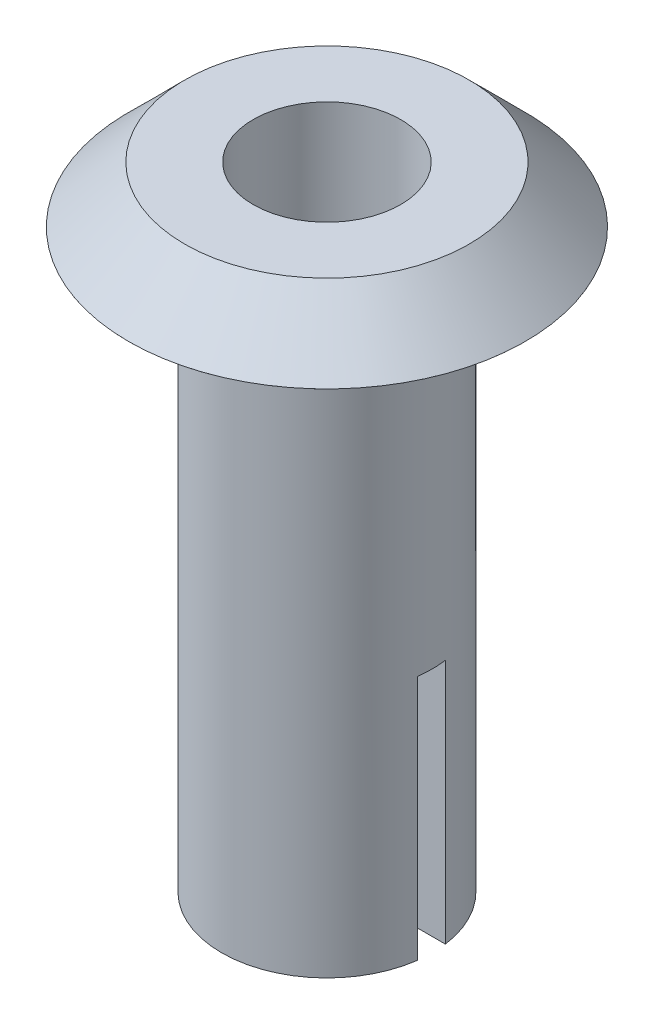
ISO-10303-21;
HEADER;
FILE_DESCRIPTION(('STEP AP214'),'2;1');
FILE_NAME('part.step','',(''),(''),'','','');
FILE_SCHEMA(('AUTOMOTIVE_DESIGN { 1 0 10303 214 1 1 1 1 }'));
ENDSEC;
DATA;
#1=APPLICATION_CONTEXT('core data for automotive mechanical design processes');
#2=APPLICATION_PROTOCOL_DEFINITION('international standard','automotive_design',2000,#1);
#3=PRODUCT_CONTEXT('',#1,'mechanical');
#4=PRODUCT('Part','Part','',(#3));
#5=PRODUCT_RELATED_PRODUCT_CATEGORY('part','',(#4));
#6=PRODUCT_DEFINITION_FORMATION('','',#4);
#7=PRODUCT_DEFINITION_CONTEXT('part definition',#1,'design');
#8=PRODUCT_DEFINITION('design','',#6,#7);
#9=PRODUCT_DEFINITION_SHAPE('','',#8);
#10=(LENGTH_UNIT() NAMED_UNIT(*) SI_UNIT(.MILLI.,.METRE.));
#11=(NAMED_UNIT(*) PLANE_ANGLE_UNIT() SI_UNIT($,.RADIAN.));
#12=(NAMED_UNIT(*) SI_UNIT($,.STERADIAN.) SOLID_ANGLE_UNIT());
#13=UNCERTAINTY_MEASURE_WITH_UNIT(LENGTH_MEASURE(1.E-05),#10,'distance_accuracy_value','');
#14=(GEOMETRIC_REPRESENTATION_CONTEXT(3) GLOBAL_UNCERTAINTY_ASSIGNED_CONTEXT((#13)) GLOBAL_UNIT_ASSIGNED_CONTEXT((#10,
#11,#12)) REPRESENTATION_CONTEXT('',''));
#15=CARTESIAN_POINT('',(0.,0.,0.));
#16=DIRECTION('',(0.,0.,1.));
#17=DIRECTION('',(1.,0.,0.));
#18=AXIS2_PLACEMENT_3D('',#15,#16,#17);
#19=CARTESIAN_POINT('',(0.,0.,0.));
#20=DIRECTION('',(0.,1.,0.));
#21=DIRECTION('',(0.,0.,1.));
#22=AXIS2_PLACEMENT_3D('',#19,#20,#21);
#23=PLANE('',#22);
#24=CARTESIAN_POINT('',(0.,0.,0.));
#25=DIRECTION('',(0.,1.,0.));
#26=DIRECTION('',(0.,0.,1.));
#27=AXIS2_PLACEMENT_3D('',#24,#25,#26);
#28=CIRCLE('',#27,1.5);
#29=CARTESIAN_POINT('',(1.48660687473185,0.,-0.2));
#30=VERTEX_POINT('',#29);
#31=CARTESIAN_POINT('',(-1.48660687473185,0.,-0.2));
#32=VERTEX_POINT('',#31);
#33=EDGE_CURVE('E131',#30,#32,#28,.T.);
#34=ORIENTED_EDGE('',*,*,#33,.F.);
#35=DIRECTION('',(1.,0.,0.));
#36=VECTOR('',#35,1.);
#37=CARTESIAN_POINT('',(-1.5,0.,-0.2));
#38=LINE('',#37,#36);
#39=EDGE_CURVE('E118',#32,#30,#38,.T.);
#40=ORIENTED_EDGE('',*,*,#39,.F.);
#41=EDGE_LOOP('',(#34,#40));
#42=FACE_BOUND('',#41,.T.);
#43=ADVANCED_FACE('F35',(#42),#23,.F.);
#44=CARTESIAN_POINT('',(0.,1.5001,0.));
#45=DIRECTION('',(0.,1.,0.));
#46=DIRECTION('',(0.,0.,1.));
#47=AXIS2_PLACEMENT_3D('',#44,#45,#46);
#48=PLANE('',#47);
#49=DIRECTION('',(-1.,0.,0.));
#50=VECTOR('',#49,1.);
#51=CARTESIAN_POINT('',(0.,1.5001,-0.2));
#52=LINE('',#51,#50);
#53=CARTESIAN_POINT('',(0.15,1.5001,-0.2));
#54=VERTEX_POINT('',#53);
#55=CARTESIAN_POINT('',(-0.150000000000001,1.50009999999999,-0.2));
#56=VERTEX_POINT('',#55);
#57=EDGE_CURVE('E128',#54,#56,#52,.T.);
#58=ORIENTED_EDGE('',*,*,#57,.F.);
#59=CARTESIAN_POINT('',(0.,1.5001,0.));
#60=DIRECTION('',(0.,1.,0.));
#61=DIRECTION('',(0.,0.,1.));
#62=AXIS2_PLACEMENT_3D('',#59,#60,#61);
#63=CIRCLE('',#62,0.25);
#64=EDGE_CURVE('E152',#54,#56,#63,.T.);
#65=ORIENTED_EDGE('',*,*,#64,.T.);
#66=EDGE_LOOP('',(#58,#65));
#67=FACE_BOUND('',#66,.T.);
#68=ADVANCED_FACE('F177',(#67),#48,.T.);
#69=CARTESIAN_POINT('',(0.,2.3001,0.));
#70=DIRECTION('',(0.,1.,0.));
#71=DIRECTION('',(0.,0.,1.));
#72=AXIS2_PLACEMENT_3D('',#69,#70,#71);
#73=DEGENERATE_TOROIDAL_SURFACE('',#72,0.25,0.8,.T.);
#74=ORIENTED_EDGE('',*,*,#64,.F.);
#75=CARTESIAN_POINT('',(0.,1.50166402886642,-0.2));
#76=CARTESIAN_POINT('',(0.0166698415826688,1.50166571667046,-0.2));
#77=CARTESIAN_POINT('',(0.0333398856129194,1.5015243846989,-0.2));
#78=CARTESIAN_POINT('',(0.0666781693266342,1.50108013124724,-0.2));
#79=CARTESIAN_POINT('',(0.0833464085193591,1.50077718944308,-0.2));
#80=CARTESIAN_POINT('',(0.1334092614839,1.50005060911422,-0.2));
#81=CARTESIAN_POINT('',(0.166812993914217,1.49981064587632,-0.2));
#82=CARTESIAN_POINT('',(0.229406412635807,1.50162846407508,-0.2));
#83=CARTESIAN_POINT('',(0.258601027229079,1.5034028341242,-0.2));
#84=CARTESIAN_POINT('',(0.316743266893158,1.50943838792807,-0.2));
#85=CARTESIAN_POINT('',(0.345690900061749,1.51369948982991,-0.2));
#86=CARTESIAN_POINT('',(0.402991969738191,1.52499097991025,-0.2));
#87=CARTESIAN_POINT('',(0.43134645596889,1.53201594533592,-0.2));
#88=CARTESIAN_POINT('',(0.487189985294854,1.54892644422566,-0.2));
#89=CARTESIAN_POINT('',(0.51467891698504,1.55881234426391,-0.2));
#90=CARTESIAN_POINT('',(0.583350982841369,1.58770457877811,-0.2));
#91=CARTESIAN_POINT('',(0.623707050723279,1.608732010134,-0.2));
#92=CARTESIAN_POINT('',(0.70034544039585,1.65728696231791,-0.2));
#93=CARTESIAN_POINT('',(0.736623667136238,1.68482093259039,-0.2));
#94=CARTESIAN_POINT('',(0.8039971339138,1.74568309567333,-0.2));
#95=CARTESIAN_POINT('',(0.835088877571679,1.77901516649863,-0.2));
#96=CARTESIAN_POINT('',(0.891088036855366,1.85049982703332,-0.2));
#97=CARTESIAN_POINT('',(0.91599833710029,1.88865015567519,-0.2));
#98=CARTESIAN_POINT('',(0.958481280077041,1.96790347324701,-0.2));
#99=CARTESIAN_POINT('',(0.976184281869382,2.00893663331438,-0.2));
#100=CARTESIAN_POINT('',(1.00439993048064,2.09340914612502,-0.2));
#101=CARTESIAN_POINT('',(1.01491219899784,2.13684862533388,-0.2));
#102=CARTESIAN_POINT('',(1.02838751393651,2.22458296266082,-0.2));
#103=CARTESIAN_POINT('',(1.03140084062819,2.26887010627033,-0.2));
#104=CARTESIAN_POINT('',(1.02993685654376,2.35732453651702,-0.2));
#105=CARTESIAN_POINT('',(1.02545891825336,2.40149181280298,-0.2));
#106=CARTESIAN_POINT('',(1.00915342271604,2.48838340979925,-0.2));
#107=CARTESIAN_POINT('',(0.997336178055473,2.5311096666496,-0.2));
#108=CARTESIAN_POINT('',(0.966713242045891,2.61395512181443,-0.2));
#109=CARTESIAN_POINT('',(0.947910965567331,2.6540755828194,-0.2));
#110=CARTESIAN_POINT('',(0.903839144046234,2.73065069145779,-0.2));
#111=CARTESIAN_POINT('',(0.878562317198208,2.76710114677823,-0.2));
#112=CARTESIAN_POINT('',(0.822245470323173,2.83532842733279,-0.2));
#113=CARTESIAN_POINT('',(0.791196792082228,2.86709810098076,-0.2));
#114=CARTESIAN_POINT('',(0.724008067566469,2.92527142435174,-0.2));
#115=CARTESIAN_POINT('',(0.687830871368458,2.95163214192628,-0.2));
#116=CARTESIAN_POINT('',(0.611776285106589,2.9979354345787,-0.2));
#117=CARTESIAN_POINT('',(0.571913327608463,3.01790178231344,-0.2));
#118=CARTESIAN_POINT('',(0.488698905847722,3.05152795161462,-0.2));
#119=CARTESIAN_POINT('',(0.445293861557957,3.06505457212068,-0.2));
#120=CARTESIAN_POINT('',(0.356717442684082,3.08530811915976,-0.2));
#121=CARTESIAN_POINT('',(0.311537986720364,3.09199895064935,-0.2));
#122=CARTESIAN_POINT('',(0.243810832825528,3.09765746387715,-0.2));
#123=CARTESIAN_POINT('',(0.221405555467714,3.09882104800239,-0.2));
#124=CARTESIAN_POINT('',(0.176559166379535,3.10008848768721,-0.2));
#125=CARTESIAN_POINT('',(0.154118045261468,3.10019199329407,-0.2));
#126=CARTESIAN_POINT('',(0.109196727516646,3.09986873007227,-0.2));
#127=CARTESIAN_POINT('',(0.086716553458095,3.09944079485711,-0.2));
#128=CARTESIAN_POINT('',(0.0417602725450971,3.09876428051567,-0.2));
#129=CARTESIAN_POINT('',(0.0192841675849667,3.09851563069695,-0.2));
#130=CARTESIAN_POINT('',(-0.0256602785195892,3.0985594930865,-0.2));
#131=CARTESIAN_POINT('',(-0.0481286199316127,3.09885183940198,-0.2));
#132=CARTESIAN_POINT('',(-0.0930716344119249,3.09955118293042,-0.2));
#133=CARTESIAN_POINT('',(-0.11554630617063,3.09995822829498,-0.2));
#134=CARTESIAN_POINT('',(-0.160455392283717,3.10018035007007,-0.2));
#135=CARTESIAN_POINT('',(-0.182889787694873,3.09999671397185,-0.2));
#136=CARTESIAN_POINT('',(-0.227717260508837,3.09852636404797,-0.2));
#137=CARTESIAN_POINT('',(-0.250110352920595,3.09724019939141,-0.2));
#138=CARTESIAN_POINT('',(-0.296297968778293,3.09312072295697,-0.2));
#139=CARTESIAN_POINT('',(-0.320084183523528,3.09018810205309,-0.2));
#140=CARTESIAN_POINT('',(-0.367381071661446,3.08251258442502,-0.2));
#141=CARTESIAN_POINT('',(-0.390891486534654,3.07776811045488,-0.2));
#142=CARTESIAN_POINT('',(-0.460460798783884,3.06072186606951,-0.2));
#143=CARTESIAN_POINT('',(-0.505869337426221,3.04558316011647,-0.2));
#144=CARTESIAN_POINT('',(-0.593621321286191,3.00758337797835,-0.2));
#145=CARTESIAN_POINT('',(-0.635946841713136,2.98468093791962,-0.2));
#146=CARTESIAN_POINT('',(-0.716023573084662,2.93160345969393,-0.2));
#147=CARTESIAN_POINT('',(-0.753756166231605,2.90140021266384,-0.2));
#148=CARTESIAN_POINT('',(-0.82122693284102,2.83652498131007,-0.2));
#149=CARTESIAN_POINT('',(-0.85129133705298,2.80219152148355,-0.2));
#150=CARTESIAN_POINT('',(-0.905034875406045,2.72893181931438,-0.2));
#151=CARTESIAN_POINT('',(-0.928725093673388,2.69001372097015,-0.2));
#152=CARTESIAN_POINT('',(-0.968651849943626,2.60950280684566,-0.2));
#153=CARTESIAN_POINT('',(-0.985028556964881,2.5679794247673,-0.2));
#154=CARTESIAN_POINT('',(-1.01053977879569,2.48274183353331,-0.2));
#155=CARTESIAN_POINT('',(-1.01967100083736,2.43902663787444,-0.2));
#156=CARTESIAN_POINT('',(-1.03037488252278,2.35095439400306,-0.2));
#157=CARTESIAN_POINT('',(-1.0319936625118,2.30660294352136,-0.2));
#158=CARTESIAN_POINT('',(-1.02775164201873,2.21826517229983,-0.2));
#159=CARTESIAN_POINT('',(-1.0218918980028,2.17427880086995,-0.2));
#160=CARTESIAN_POINT('',(-1.00287715257568,2.08796873376396,-0.2));
#161=CARTESIAN_POINT('',(-0.989730984078272,2.0456430912738,-0.2));
#162=CARTESIAN_POINT('',(-0.956532739392012,1.9637942509764,-0.2));
#163=CARTESIAN_POINT('',(-0.936480727484413,1.92427102708769,-0.2));
#164=CARTESIAN_POINT('',(-0.89000930653147,1.84906071693307,-0.2));
#165=CARTESIAN_POINT('',(-0.863577783044371,1.81338111826882,-0.2));
#166=CARTESIAN_POINT('',(-0.805135950061446,1.74692476724933,-0.2));
#167=CARTESIAN_POINT('',(-0.773124960237336,1.71614861366918,-0.2));
#168=CARTESIAN_POINT('',(-0.704201964591778,1.66011251929112,-0.2));
#169=CARTESIAN_POINT('',(-0.667255690928788,1.63489475116404,-0.2));
#170=CARTESIAN_POINT('',(-0.589750741014979,1.59087804904981,-0.2));
#171=CARTESIAN_POINT('',(-0.549193354238049,1.5720768353066,-0.2));
#172=CARTESIAN_POINT('',(-0.464618124035503,1.54082506566216,-0.2));
#173=CARTESIAN_POINT('',(-0.420541481173459,1.52853355976589,-0.2));
#174=CARTESIAN_POINT('',(-0.353478204694671,1.51519374710883,-0.2));
#175=CARTESIAN_POINT('',(-0.330958738023759,1.51159639946551,-0.2));
#176=CARTESIAN_POINT('',(-0.285725184481576,1.50596298451672,-0.2));
#177=CARTESIAN_POINT('',(-0.263011112275252,1.50392680059455,-0.2));
#178=CARTESIAN_POINT('',(-0.220265046414644,1.50134704085338,-0.2));
#179=CARTESIAN_POINT('',(-0.200241187409336,1.50065263236869,-0.2));
#180=CARTESIAN_POINT('',(-0.160181956336417,1.50000890941707,-0.2));
#181=CARTESIAN_POINT('',(-0.140146582936294,1.50005971462649,-0.2));
#182=CARTESIAN_POINT('',(-0.100092386262173,1.50048895406501,-0.2));
#183=CARTESIAN_POINT('',(-0.0800735597774635,1.50086721965425,-0.2));
#184=CARTESIAN_POINT('',(-0.0400365856593522,1.50145372536468,-0.2));
#185=CARTESIAN_POINT('',(-0.0200184388052065,1.50166200202041,-0.2));
#186=CARTESIAN_POINT('',(0.,1.50166402886642,-0.2));
#187=B_SPLINE_CURVE_WITH_KNOTS('',3,(#75,#76,#77,#78,#79,#80,#81,#82,#83,#84,#85,#86,#87,#88,
#89,#90,#91,#92,#93,#94,#95,#96,#97,#98,#99,#100,#101,#102,#103,#104,#105,#106,#107,#108,#109,
#110,#111,#112,#113,#114,#115,#116,#117,#118,#119,#120,#121,#122,#123,#124,#125,#126,#127,#128,
#129,#130,#131,#132,#133,#134,#135,#136,#137,#138,#139,#140,#141,#142,#143,#144,#145,#146,#147,
#148,#149,#150,#151,#152,#153,#154,#155,#156,#157,#158,#159,#160,#161,#162,#163,#164,#165,#166,
#167,#168,#169,#170,#171,#172,#173,#174,#175,#176,#177,#178,#179,#180,#181,#182,#183,#184,#185,
#186),.UNSPECIFIED.,.T.,.F.,(4,2,2,2,2,2,2,2,2,2,2,2,2,2,2,2,2,2,2,2,2,2,2,2,2,2,2,2,2,2,2,2,2,
2,2,2,2,2,2,2,2,2,2,2,2,2,2,2,2,2,2,2,2,2,2,4),(0.,0.0500092875870138,0.100024865829181,
0.200203184706985,0.287861777597849,0.375517485293757,0.463002061677427,0.550497852506859,
0.686345267481207,0.822327906861565,0.958401849368154,1.09441217197756,1.22783965644739,
1.36127415994634,1.49381154741136,1.62636003757694,1.75872270162411,1.8910207406544,
2.02346823117991,2.15611603011067,2.28977910205329,2.42293931893524,2.55874556687355,
2.69526526367023,2.76254952674017,2.82985600094964,2.89731045831805,2.96473830375306,
3.03214547632458,3.09958098925381,3.16686961463669,3.23412474304008,3.3059556878525,
3.37784930567182,3.52070973803225,3.66434359216108,3.80854154820458,3.94478310926737,
4.08078620473341,4.21405728780716,4.34738890234448,4.4799008756818,4.61239413156609,
4.74472712366483,4.87705888400943,5.00964394211279,5.14224517820572,5.27582027582979,
5.40934786564634,5.54600276763964,5.6143717931752,5.68273571114481,5.74282493822376,
5.80292381533889,5.86299176034259,5.9230467919569),.UNSPECIFIED.);
#188=CARTESIAN_POINT('',(1.03077640640442,2.3001,-0.2));
#189=VERTEX_POINT('',#188);
#190=EDGE_CURVE('E253',#54,#189,#187,.T.);
#191=ORIENTED_EDGE('',*,*,#190,.T.);
#192=CARTESIAN_POINT('',(0.,2.3001,0.));
#193=DIRECTION('',(0.,1.,0.));
#194=DIRECTION('',(0.,0.,1.));
#195=AXIS2_PLACEMENT_3D('',#192,#193,#194);
#196=CIRCLE('',#195,1.05);
#197=CARTESIAN_POINT('',(-1.03077640641938,2.30010000000522,-0.2));
#198=VERTEX_POINT('',#197);
#199=EDGE_CURVE('E156',#198,#189,#196,.F.);
#200=ORIENTED_EDGE('',*,*,#199,.F.);
#201=EDGE_CURVE('E162',#198,#56,#187,.T.);
#202=ORIENTED_EDGE('',*,*,#201,.T.);
#203=EDGE_LOOP('',(#74,#191,#200,#202));
#204=FACE_BOUND('',#203,.T.);
#205=ADVANCED_FACE('F197',(#204),#73,.F.);
#206=CARTESIAN_POINT('',(0.,9.,0.));
#207=DIRECTION('',(0.,-1.,0.));
#208=DIRECTION('',(0.,0.,-1.));
#209=AXIS2_PLACEMENT_3D('',#206,#207,#208);
#210=CYLINDRICAL_SURFACE('',#209,1.5);
#211=CARTESIAN_POINT('',(0.,3.5,0.));
#212=DIRECTION('',(0.,-1.,0.));
#213=DIRECTION('',(0.,0.,-1.));
#214=AXIS2_PLACEMENT_3D('',#211,#212,#213);
#215=CIRCLE('',#214,1.5);
#216=CARTESIAN_POINT('',(1.48660687473185,3.5,-0.2));
#217=VERTEX_POINT('',#216);
#218=CARTESIAN_POINT('',(1.48660687473185,3.5,0.2));
#219=VERTEX_POINT('',#218);
#220=EDGE_CURVE('E215',#217,#219,#215,.T.);
#221=ORIENTED_EDGE('',*,*,#220,.F.);
#222=DIRECTION('',(0.,-1.,0.));
#223=VECTOR('',#222,1.);
#224=CARTESIAN_POINT('',(1.48660687473185,9.,-0.2));
#225=LINE('',#224,#223);
#226=EDGE_CURVE('E214',#217,#30,#225,.T.);
#227=ORIENTED_EDGE('',*,*,#226,.T.);
#228=ORIENTED_EDGE('',*,*,#33,.T.);
#229=DIRECTION('',(0.,-1.,0.));
#230=VECTOR('',#229,1.);
#231=CARTESIAN_POINT('',(-1.48660687473185,9.,-0.2));
#232=LINE('',#231,#230);
#233=CARTESIAN_POINT('',(-1.48660687473185,3.5,-0.2));
#234=VERTEX_POINT('',#233);
#235=EDGE_CURVE('E213',#32,#234,#232,.F.);
#236=ORIENTED_EDGE('',*,*,#235,.T.);
#237=CARTESIAN_POINT('',(-1.48660687473185,3.5,0.2));
#238=VERTEX_POINT('',#237);
#239=EDGE_CURVE('E127',#238,#234,#215,.T.);
#240=ORIENTED_EDGE('',*,*,#239,.F.);
#241=DIRECTION('',(0.,-1.,0.));
#242=VECTOR('',#241,1.);
#243=CARTESIAN_POINT('',(-1.48660687473185,9.,0.2));
#244=LINE('',#243,#242);
#245=CARTESIAN_POINT('',(-1.48660687473185,0.,0.2));
#246=VERTEX_POINT('',#245);
#247=EDGE_CURVE('E113',#238,#246,#244,.T.);
#248=ORIENTED_EDGE('',*,*,#247,.T.);
#249=CARTESIAN_POINT('',(1.48660687473185,0.,0.2));
#250=VERTEX_POINT('',#249);
#251=EDGE_CURVE('E125',#246,#250,#28,.T.);
#252=ORIENTED_EDGE('',*,*,#251,.T.);
#253=DIRECTION('',(0.,-1.,0.));
#254=VECTOR('',#253,1.);
#255=CARTESIAN_POINT('',(1.48660687473185,9.,0.2));
#256=LINE('',#255,#254);
#257=EDGE_CURVE('E51',#250,#219,#256,.F.);
#258=ORIENTED_EDGE('',*,*,#257,.T.);
#259=EDGE_LOOP('',(#221,#227,#228,#236,#240,#248,#252,#258));
#260=FACE_BOUND('',#259,.T.);
#261=CARTESIAN_POINT('',(0.,8.2,0.));
#262=DIRECTION('',(0.,1.,0.));
#263=DIRECTION('',(0.,0.,1.));
#264=AXIS2_PLACEMENT_3D('',#261,#262,#263);
#265=CIRCLE('',#264,1.5);
#266=CARTESIAN_POINT('',(0.,8.2,1.5));
#267=VERTEX_POINT('',#266);
#268=EDGE_CURVE('E135',#267,#267,#265,.T.);
#269=ORIENTED_EDGE('',*,*,#268,.F.);
#270=EDGE_LOOP('',(#269));
#271=FACE_BOUND('',#270,.T.);
#272=ADVANCED_FACE('F123',(#260,#271),#210,.T.);
#273=ORIENTED_EDGE('',*,*,#251,.F.);
#274=DIRECTION('',(-1.,0.,0.));
#275=VECTOR('',#274,1.);
#276=CARTESIAN_POINT('',(-1.5,0.,0.2));
#277=LINE('',#276,#275);
#278=EDGE_CURVE('E109',#250,#246,#277,.T.);
#279=ORIENTED_EDGE('',*,*,#278,.F.);
#280=EDGE_LOOP('',(#273,#279));
#281=FACE_BOUND('',#280,.T.);
#282=ADVANCED_FACE('F130',(#281),#23,.F.);
#283=CARTESIAN_POINT('',(0.,8.2,0.));
#284=DIRECTION('',(0.,1.,0.));
#285=DIRECTION('',(0.,0.,1.));
#286=AXIS2_PLACEMENT_3D('',#283,#284,#285);
#287=PLANE('',#286);
#288=CARTESIAN_POINT('',(0.,8.2,0.));
#289=DIRECTION('',(0.,1.,0.));
#290=DIRECTION('',(0.,0.,1.));
#291=AXIS2_PLACEMENT_3D('',#288,#289,#290);
#292=CIRCLE('',#291,2.825);
#293=CARTESIAN_POINT('',(0.,8.2,2.825));
#294=VERTEX_POINT('',#293);
#295=EDGE_CURVE('E132',#294,#294,#292,.T.);
#296=ORIENTED_EDGE('',*,*,#295,.F.);
#297=EDGE_LOOP('',(#296));
#298=FACE_BOUND('',#297,.T.);
#299=ORIENTED_EDGE('',*,*,#268,.T.);
#300=EDGE_LOOP('',(#299));
#301=FACE_BOUND('',#300,.T.);
#302=ADVANCED_FACE('F187',(#298,#301),#287,.F.);
#303=CARTESIAN_POINT('',(0.,8.2,0.));
#304=DIRECTION('',(0.,1.,0.));
#305=DIRECTION('',(0.,0.,1.));
#306=AXIS2_PLACEMENT_3D('',#303,#304,#305);
#307=CYLINDRICAL_SURFACE('',#306,2.825);
#308=CARTESIAN_POINT('',(0.,8.2001,0.));
#309=DIRECTION('',(0.,1.,0.));
#310=DIRECTION('',(0.,0.,1.));
#311=AXIS2_PLACEMENT_3D('',#308,#309,#310);
#312=CIRCLE('',#311,2.825);
#313=CARTESIAN_POINT('',(0.,8.2001,2.825));
#314=VERTEX_POINT('',#313);
#315=EDGE_CURVE('E146',#314,#314,#312,.F.);
#316=ORIENTED_EDGE('',*,*,#315,.T.);
#317=EDGE_LOOP('',(#316));
#318=FACE_BOUND('',#317,.T.);
#319=ORIENTED_EDGE('',*,*,#295,.T.);
#320=EDGE_LOOP('',(#319));
#321=FACE_BOUND('',#320,.T.);
#322=ADVANCED_FACE('F185',(#318,#321),#307,.T.);
#323=CARTESIAN_POINT('',(0.,9.0001,0.));
#324=DIRECTION('',(0.,1.,0.));
#325=DIRECTION('',(0.,0.,1.));
#326=AXIS2_PLACEMENT_3D('',#323,#324,#325);
#327=PLANE('',#326);
#328=CARTESIAN_POINT('',(0.,9.0001,0.));
#329=DIRECTION('',(0.,1.,0.));
#330=DIRECTION('',(0.,0.,1.));
#331=AXIS2_PLACEMENT_3D('',#328,#329,#330);
#332=CIRCLE('',#331,1.05);
#333=CARTESIAN_POINT('',(0.,9.0001,1.05));
#334=VERTEX_POINT('',#333);
#335=EDGE_CURVE('E137',#334,#334,#332,.T.);
#336=ORIENTED_EDGE('',*,*,#335,.F.);
#337=EDGE_LOOP('',(#336));
#338=FACE_BOUND('',#337,.T.);
#339=CARTESIAN_POINT('',(0.,9.0001,0.));
#340=DIRECTION('',(0.,1.,0.));
#341=DIRECTION('',(0.,0.,1.));
#342=AXIS2_PLACEMENT_3D('',#339,#340,#341);
#343=CIRCLE('',#342,2.025);
#344=CARTESIAN_POINT('',(0.,9.0001,2.025));
#345=VERTEX_POINT('',#344);
#346=EDGE_CURVE('E143',#345,#345,#343,.T.);
#347=ORIENTED_EDGE('',*,*,#346,.T.);
#348=EDGE_LOOP('',(#347));
#349=FACE_BOUND('',#348,.T.);
#350=ADVANCED_FACE('F182',(#338,#349),#327,.T.);
#351=CARTESIAN_POINT('',(0.,9.0001,0.));
#352=DIRECTION('',(0.,-1.,0.));
#353=DIRECTION('',(0.,0.,-1.));
#354=AXIS2_PLACEMENT_3D('',#351,#352,#353);
#355=CONICAL_SURFACE('',#354,2.025,0.785398163397448);
#356=ORIENTED_EDGE('',*,*,#315,.F.);
#357=EDGE_LOOP('',(#356));
#358=FACE_BOUND('',#357,.T.);
#359=ORIENTED_EDGE('',*,*,#346,.F.);
#360=EDGE_LOOP('',(#359));
#361=FACE_BOUND('',#360,.T.);
#362=ADVANCED_FACE('F180',(#358,#361),#355,.T.);
#363=CARTESIAN_POINT('',(0.,1.5001,0.));
#364=DIRECTION('',(0.,1.,0.));
#365=DIRECTION('',(0.,0.,1.));
#366=AXIS2_PLACEMENT_3D('',#363,#364,#365);
#367=CYLINDRICAL_SURFACE('',#366,1.05);
#368=CARTESIAN_POINT('',(0.,3.5,0.));
#369=DIRECTION('',(0.,-1.,0.));
#370=DIRECTION('',(0.,0.,-1.));
#371=AXIS2_PLACEMENT_3D('',#368,#369,#370);
#372=CIRCLE('',#371,1.05);
#373=CARTESIAN_POINT('',(-1.03077640640442,3.5,-0.2));
#374=VERTEX_POINT('',#373);
#375=CARTESIAN_POINT('',(-1.03077640640442,3.5,0.2));
#376=VERTEX_POINT('',#375);
#377=EDGE_CURVE('E11',#374,#376,#372,.F.);
#378=ORIENTED_EDGE('',*,*,#377,.F.);
#379=DIRECTION('',(0.,1.,0.));
#380=VECTOR('',#379,1.);
#381=CARTESIAN_POINT('',(-1.03077640640442,1.5001,-0.2));
#382=LINE('',#381,#380);
#383=EDGE_CURVE('E246',#374,#198,#382,.F.);
#384=ORIENTED_EDGE('',*,*,#383,.T.);
#385=ORIENTED_EDGE('',*,*,#199,.T.);
#386=DIRECTION('',(0.,1.,0.));
#387=VECTOR('',#386,1.);
#388=CARTESIAN_POINT('',(1.03077640640442,1.5001,-0.2));
#389=LINE('',#388,#387);
#390=CARTESIAN_POINT('',(1.03077640640442,3.5,-0.2));
#391=VERTEX_POINT('',#390);
#392=EDGE_CURVE('E221',#189,#391,#389,.T.);
#393=ORIENTED_EDGE('',*,*,#392,.T.);
#394=CARTESIAN_POINT('',(1.03077640640442,3.5,0.2));
#395=VERTEX_POINT('',#394);
#396=EDGE_CURVE('E40',#395,#391,#372,.F.);
#397=ORIENTED_EDGE('',*,*,#396,.F.);
#398=DIRECTION('',(0.,1.,0.));
#399=VECTOR('',#398,1.);
#400=CARTESIAN_POINT('',(1.03077640640442,1.5001,0.2));
#401=LINE('',#400,#399);
#402=CARTESIAN_POINT('',(1.03077640641938,2.30010000000522,0.2));
#403=VERTEX_POINT('',#402);
#404=EDGE_CURVE('E236',#395,#403,#401,.F.);
#405=ORIENTED_EDGE('',*,*,#404,.T.);
#406=CARTESIAN_POINT('',(-1.03077640640442,2.3001,0.2));
#407=VERTEX_POINT('',#406);
#408=EDGE_CURVE('E153',#403,#407,#196,.F.);
#409=ORIENTED_EDGE('',*,*,#408,.T.);
#410=DIRECTION('',(0.,1.,0.));
#411=VECTOR('',#410,1.);
#412=CARTESIAN_POINT('',(-1.03077640640442,1.5001,0.2));
#413=LINE('',#412,#411);
#414=EDGE_CURVE('E239',#407,#376,#413,.T.);
#415=ORIENTED_EDGE('',*,*,#414,.T.);
#416=EDGE_LOOP('',(#378,#384,#385,#393,#397,#405,#409,#415));
#417=FACE_BOUND('',#416,.T.);
#418=ORIENTED_EDGE('',*,*,#335,.T.);
#419=EDGE_LOOP('',(#418));
#420=FACE_BOUND('',#419,.T.);
#421=ADVANCED_FACE('F175',(#417,#420),#367,.F.);
#422=DIRECTION('',(1.,0.,0.));
#423=VECTOR('',#422,1.);
#424=CARTESIAN_POINT('',(0.,1.5001,0.2));
#425=LINE('',#424,#423);
#426=CARTESIAN_POINT('',(-0.15,1.5001,0.2));
#427=VERTEX_POINT('',#426);
#428=CARTESIAN_POINT('',(0.15,1.5001,0.2));
#429=VERTEX_POINT('',#428);
#430=EDGE_CURVE('E58',#427,#429,#425,.T.);
#431=ORIENTED_EDGE('',*,*,#430,.F.);
#432=EDGE_CURVE('E149',#427,#429,#63,.T.);
#433=ORIENTED_EDGE('',*,*,#432,.T.);
#434=EDGE_LOOP('',(#431,#433));
#435=FACE_BOUND('',#434,.T.);
#436=ADVANCED_FACE('F172',(#435),#48,.T.);
#437=ORIENTED_EDGE('',*,*,#432,.F.);
#438=CARTESIAN_POINT('',(0.,1.50166402886642,0.2));
#439=CARTESIAN_POINT('',(-0.0166698415826688,1.50166571667046,0.2));
#440=CARTESIAN_POINT('',(-0.0333398856129194,1.5015243846989,0.2));
#441=CARTESIAN_POINT('',(-0.0666781693266342,1.50108013124724,0.2));
#442=CARTESIAN_POINT('',(-0.0833464085193591,1.50077718944308,0.2));
#443=CARTESIAN_POINT('',(-0.1334092614839,1.50005060911422,0.2));
#444=CARTESIAN_POINT('',(-0.166812993914217,1.49981064587632,0.2));
#445=CARTESIAN_POINT('',(-0.229406412635807,1.50162846407508,0.2));
#446=CARTESIAN_POINT('',(-0.258601027229079,1.5034028341242,0.2));
#447=CARTESIAN_POINT('',(-0.316743266893158,1.50943838792807,0.2));
#448=CARTESIAN_POINT('',(-0.345690900061749,1.51369948982991,0.2));
#449=CARTESIAN_POINT('',(-0.402991969738191,1.52499097991025,0.2));
#450=CARTESIAN_POINT('',(-0.43134645596889,1.53201594533592,0.2));
#451=CARTESIAN_POINT('',(-0.487189985294854,1.54892644422566,0.2));
#452=CARTESIAN_POINT('',(-0.51467891698504,1.55881234426391,0.2));
#453=CARTESIAN_POINT('',(-0.583350982841369,1.58770457877811,0.2));
#454=CARTESIAN_POINT('',(-0.623707050723279,1.608732010134,0.2));
#455=CARTESIAN_POINT('',(-0.70034544039585,1.65728696231791,0.2));
#456=CARTESIAN_POINT('',(-0.736623667136238,1.68482093259039,0.2));
#457=CARTESIAN_POINT('',(-0.8039971339138,1.74568309567333,0.2));
#458=CARTESIAN_POINT('',(-0.835088877571679,1.77901516649863,0.2));
#459=CARTESIAN_POINT('',(-0.891088036855366,1.85049982703332,0.2));
#460=CARTESIAN_POINT('',(-0.91599833710029,1.88865015567519,0.2));
#461=CARTESIAN_POINT('',(-0.958481280077041,1.96790347324701,0.2));
#462=CARTESIAN_POINT('',(-0.976184281869382,2.00893663331438,0.2));
#463=CARTESIAN_POINT('',(-1.00439993048064,2.09340914612502,0.2));
#464=CARTESIAN_POINT('',(-1.01491219899784,2.13684862533388,0.2));
#465=CARTESIAN_POINT('',(-1.02838751393651,2.22458296266082,0.2));
#466=CARTESIAN_POINT('',(-1.03140084062819,2.26887010627033,0.2));
#467=CARTESIAN_POINT('',(-1.02993685654376,2.35732453651702,0.2));
#468=CARTESIAN_POINT('',(-1.02545891825336,2.40149181280298,0.2));
#469=CARTESIAN_POINT('',(-1.00915342271604,2.48838340979925,0.2));
#470=CARTESIAN_POINT('',(-0.997336178055473,2.5311096666496,0.2));
#471=CARTESIAN_POINT('',(-0.966713242045891,2.61395512181443,0.2));
#472=CARTESIAN_POINT('',(-0.94791096556733,2.6540755828194,0.2));
#473=CARTESIAN_POINT('',(-0.903839144046234,2.73065069145779,0.2));
#474=CARTESIAN_POINT('',(-0.878562317198208,2.76710114677823,0.2));
#475=CARTESIAN_POINT('',(-0.822245470323173,2.83532842733279,0.2));
#476=CARTESIAN_POINT('',(-0.791196792082228,2.86709810098076,0.2));
#477=CARTESIAN_POINT('',(-0.724008067566469,2.92527142435174,0.2));
#478=CARTESIAN_POINT('',(-0.687830871368458,2.95163214192628,0.2));
#479=CARTESIAN_POINT('',(-0.611776285106589,2.9979354345787,0.2));
#480=CARTESIAN_POINT('',(-0.571913327608463,3.01790178231344,0.2));
#481=CARTESIAN_POINT('',(-0.488698905847722,3.05152795161462,0.2));
#482=CARTESIAN_POINT('',(-0.445293861557956,3.06505457212068,0.2));
#483=CARTESIAN_POINT('',(-0.356717442684082,3.08530811915976,0.2));
#484=CARTESIAN_POINT('',(-0.311537986720364,3.09199895064935,0.2));
#485=CARTESIAN_POINT('',(-0.243810832825528,3.09765746387715,0.2));
#486=CARTESIAN_POINT('',(-0.221405555467714,3.09882104800239,0.2));
#487=CARTESIAN_POINT('',(-0.176559166379535,3.10008848768721,0.2));
#488=CARTESIAN_POINT('',(-0.154118045261469,3.10019199329407,0.2));
#489=CARTESIAN_POINT('',(-0.109196727516647,3.09986873007227,0.2));
#490=CARTESIAN_POINT('',(-0.0867165534580955,3.09944079485711,0.2));
#491=CARTESIAN_POINT('',(-0.0417602725450975,3.09876428051567,0.2));
#492=CARTESIAN_POINT('',(-0.019284167584967,3.09851563069695,0.2));
#493=CARTESIAN_POINT('',(0.0256602785195889,3.0985594930865,0.2));
#494=CARTESIAN_POINT('',(0.0481286199316123,3.09885183940198,0.2));
#495=CARTESIAN_POINT('',(0.0930716344119245,3.09955118293042,0.2));
#496=CARTESIAN_POINT('',(0.115546306170629,3.09995822829498,0.2));
#497=CARTESIAN_POINT('',(0.160455392283717,3.10018035007007,0.2));
#498=CARTESIAN_POINT('',(0.182889787694872,3.09999671397185,0.2));
#499=CARTESIAN_POINT('',(0.227717260508836,3.09852636404797,0.2));
#500=CARTESIAN_POINT('',(0.250110352920595,3.09724019939141,0.2));
#501=CARTESIAN_POINT('',(0.296297968778293,3.09312072295697,0.2));
#502=CARTESIAN_POINT('',(0.320084183523528,3.09018810205309,0.2));
#503=CARTESIAN_POINT('',(0.367381071661446,3.08251258442502,0.2));
#504=CARTESIAN_POINT('',(0.390891486534654,3.07776811045488,0.2));
#505=CARTESIAN_POINT('',(0.460460798783883,3.06072186606951,0.2));
#506=CARTESIAN_POINT('',(0.50586933742622,3.04558316011647,0.2));
#507=CARTESIAN_POINT('',(0.593621321286191,3.00758337797835,0.2));
#508=CARTESIAN_POINT('',(0.635946841713136,2.98468093791962,0.2));
#509=CARTESIAN_POINT('',(0.716023573084662,2.93160345969393,0.2));
#510=CARTESIAN_POINT('',(0.753756166231605,2.90140021266384,0.2));
#511=CARTESIAN_POINT('',(0.82122693284102,2.83652498131007,0.2));
#512=CARTESIAN_POINT('',(0.85129133705298,2.80219152148355,0.2));
#513=CARTESIAN_POINT('',(0.905034875406046,2.72893181931438,0.2));
#514=CARTESIAN_POINT('',(0.928725093673388,2.69001372097015,0.2));
#515=CARTESIAN_POINT('',(0.968651849943626,2.60950280684566,0.2));
#516=CARTESIAN_POINT('',(0.985028556964881,2.5679794247673,0.2));
#517=CARTESIAN_POINT('',(1.01053977879569,2.48274183353331,0.2));
#518=CARTESIAN_POINT('',(1.01967100083736,2.43902663787444,0.2));
#519=CARTESIAN_POINT('',(1.03037488252278,2.35095439400306,0.2));
#520=CARTESIAN_POINT('',(1.0319936625118,2.30660294352136,0.2));
#521=CARTESIAN_POINT('',(1.02775164201873,2.21826517229983,0.2));
#522=CARTESIAN_POINT('',(1.0218918980028,2.17427880086995,0.2));
#523=CARTESIAN_POINT('',(1.00287715257568,2.08796873376396,0.2));
#524=CARTESIAN_POINT('',(0.989730984078273,2.0456430912738,0.2));
#525=CARTESIAN_POINT('',(0.956532739392012,1.9637942509764,0.2));
#526=CARTESIAN_POINT('',(0.936480727484413,1.92427102708769,0.2));
#527=CARTESIAN_POINT('',(0.89000930653147,1.84906071693307,0.2));
#528=CARTESIAN_POINT('',(0.863577783044371,1.81338111826882,0.2));
#529=CARTESIAN_POINT('',(0.805135950061446,1.74692476724933,0.2));
#530=CARTESIAN_POINT('',(0.773124960237336,1.71614861366918,0.2));
#531=CARTESIAN_POINT('',(0.704201964591778,1.66011251929112,0.2));
#532=CARTESIAN_POINT('',(0.667255690928788,1.63489475116404,0.2));
#533=CARTESIAN_POINT('',(0.589750741014979,1.59087804904981,0.2));
#534=CARTESIAN_POINT('',(0.54919335423805,1.5720768353066,0.2));
#535=CARTESIAN_POINT('',(0.464618124035503,1.54082506566216,0.2));
#536=CARTESIAN_POINT('',(0.420541481173459,1.52853355976589,0.2));
#537=CARTESIAN_POINT('',(0.353478204694671,1.51519374710883,0.2));
#538=CARTESIAN_POINT('',(0.330958738023759,1.51159639946551,0.2));
#539=CARTESIAN_POINT('',(0.285725184481576,1.50596298451672,0.2));
#540=CARTESIAN_POINT('',(0.263011112275252,1.50392680059455,0.2));
#541=CARTESIAN_POINT('',(0.220265046414644,1.50134704085338,0.2));
#542=CARTESIAN_POINT('',(0.200241187409337,1.50065263236869,0.2));
#543=CARTESIAN_POINT('',(0.160181956336417,1.50000890941707,0.2));
#544=CARTESIAN_POINT('',(0.140146582936295,1.50005971462649,0.2));
#545=CARTESIAN_POINT('',(0.100092386262173,1.50048895406501,0.2));
#546=CARTESIAN_POINT('',(0.0800735597774638,1.50086721965425,0.2));
#547=CARTESIAN_POINT('',(0.0400365856593522,1.50145372536468,0.2));
#548=CARTESIAN_POINT('',(0.0200184388052065,1.50166200202041,0.2));
#549=CARTESIAN_POINT('',(0.,1.50166402886642,0.2));
#550=B_SPLINE_CURVE_WITH_KNOTS('',3,(#438,#439,#440,#441,#442,#443,#444,#445,#446,#447,#448,
#449,#450,#451,#452,#453,#454,#455,#456,#457,#458,#459,#460,#461,#462,#463,#464,#465,#466,#467,
#468,#469,#470,#471,#472,#473,#474,#475,#476,#477,#478,#479,#480,#481,#482,#483,#484,#485,#486,
#487,#488,#489,#490,#491,#492,#493,#494,#495,#496,#497,#498,#499,#500,#501,#502,#503,#504,#505,
#506,#507,#508,#509,#510,#511,#512,#513,#514,#515,#516,#517,#518,#519,#520,#521,#522,#523,#524,
#525,#526,#527,#528,#529,#530,#531,#532,#533,#534,#535,#536,#537,#538,#539,#540,#541,#542,#543,
#544,#545,#546,#547,#548,#549),.UNSPECIFIED.,.T.,.F.,(4,2,2,2,2,2,2,2,2,2,2,2,2,2,2,2,2,2,2,2,2,
2,2,2,2,2,2,2,2,2,2,2,2,2,2,2,2,2,2,2,2,2,2,2,2,2,2,2,2,2,2,2,2,2,2,4),(0.,0.0500092875870138,
0.100024865829181,0.200203184706985,0.287861777597849,0.375517485293757,0.463002061677427,
0.550497852506859,0.686345267481207,0.822327906861565,0.958401849368154,1.09441217197756,
1.22783965644739,1.36127415994634,1.49381154741136,1.62636003757694,1.75872270162411,
1.8910207406544,2.02346823117991,2.15611603011067,2.28977910205329,2.42293931893524,
2.55874556687355,2.69526526367023,2.76254952674017,2.82985600094964,2.89731045831805,
2.96473830375306,3.03214547632458,3.09958098925381,3.16686961463669,3.23412474304008,
3.3059556878525,3.37784930567182,3.52070973803225,3.66434359216108,3.80854154820458,
3.94478310926737,4.08078620473341,4.21405728780716,4.34738890234448,4.4799008756818,
4.61239413156609,4.74472712366483,4.87705888400943,5.00964394211279,5.14224517820572,
5.27582027582979,5.40934786564634,5.54600276763964,5.6143717931752,5.68273571114481,
5.74282493822376,5.80292381533889,5.86299176034259,5.9230467919569),.UNSPECIFIED.);
#551=EDGE_CURVE('E161',#427,#407,#550,.T.);
#552=ORIENTED_EDGE('',*,*,#551,.T.);
#553=ORIENTED_EDGE('',*,*,#408,.F.);
#554=EDGE_CURVE('E157',#403,#429,#550,.T.);
#555=ORIENTED_EDGE('',*,*,#554,.T.);
#556=EDGE_LOOP('',(#437,#552,#553,#555));
#557=FACE_BOUND('',#556,.T.);
#558=ADVANCED_FACE('F37',(#557),#73,.F.);
#559=CARTESIAN_POINT('',(0.,3.5,0.));
#560=DIRECTION('',(0.,-1.,0.));
#561=DIRECTION('',(0.,0.,-1.));
#562=AXIS2_PLACEMENT_3D('',#559,#560,#561);
#563=PLANE('',#562);
#564=ORIENTED_EDGE('',*,*,#220,.T.);
#565=DIRECTION('',(-1.,0.,0.));
#566=VECTOR('',#565,1.);
#567=CARTESIAN_POINT('',(-1.5,3.5,0.2));
#568=LINE('',#567,#566);
#569=EDGE_CURVE('E232',#219,#395,#568,.T.);
#570=ORIENTED_EDGE('',*,*,#569,.T.);
#571=ORIENTED_EDGE('',*,*,#396,.T.);
#572=DIRECTION('',(1.,0.,0.));
#573=VECTOR('',#572,1.);
#574=CARTESIAN_POINT('',(-1.5,3.5,-0.2));
#575=LINE('',#574,#573);
#576=EDGE_CURVE('E234',#391,#217,#575,.T.);
#577=ORIENTED_EDGE('',*,*,#576,.T.);
#578=EDGE_LOOP('',(#564,#570,#571,#577));
#579=FACE_BOUND('',#578,.T.);
#580=ADVANCED_FACE('F231',(#579),#563,.T.);
#581=ORIENTED_EDGE('',*,*,#239,.T.);
#582=EDGE_CURVE('E263',#234,#374,#575,.T.);
#583=ORIENTED_EDGE('',*,*,#582,.T.);
#584=ORIENTED_EDGE('',*,*,#377,.T.);
#585=EDGE_CURVE('E237',#376,#238,#568,.T.);
#586=ORIENTED_EDGE('',*,*,#585,.T.);
#587=EDGE_LOOP('',(#581,#583,#584,#586));
#588=FACE_BOUND('',#587,.T.);
#589=ADVANCED_FACE('F268',(#588),#563,.T.);
#590=CARTESIAN_POINT('',(-1.5,3.5,-0.2));
#591=DIRECTION('',(0.,0.,-1.));
#592=DIRECTION('',(-1.,0.,0.));
#593=AXIS2_PLACEMENT_3D('',#590,#591,#592);
#594=PLANE('',#593);
#595=ORIENTED_EDGE('',*,*,#576,.F.);
#596=ORIENTED_EDGE('',*,*,#392,.F.);
#597=ORIENTED_EDGE('',*,*,#190,.F.);
#598=ORIENTED_EDGE('',*,*,#57,.T.);
#599=ORIENTED_EDGE('',*,*,#201,.F.);
#600=ORIENTED_EDGE('',*,*,#383,.F.);
#601=ORIENTED_EDGE('',*,*,#582,.F.);
#602=ORIENTED_EDGE('',*,*,#235,.F.);
#603=ORIENTED_EDGE('',*,*,#39,.T.);
#604=ORIENTED_EDGE('',*,*,#226,.F.);
#605=EDGE_LOOP('',(#595,#596,#597,#598,#599,#600,#601,#602,#603,#604));
#606=FACE_BOUND('',#605,.T.);
#607=ADVANCED_FACE('F169',(#606),#594,.F.);
#608=CARTESIAN_POINT('',(-1.5,3.5,0.2));
#609=DIRECTION('',(0.,0.,1.));
#610=DIRECTION('',(1.,0.,0.));
#611=AXIS2_PLACEMENT_3D('',#608,#609,#610);
#612=PLANE('',#611);
#613=ORIENTED_EDGE('',*,*,#585,.F.);
#614=ORIENTED_EDGE('',*,*,#414,.F.);
#615=ORIENTED_EDGE('',*,*,#551,.F.);
#616=ORIENTED_EDGE('',*,*,#430,.T.);
#617=ORIENTED_EDGE('',*,*,#554,.F.);
#618=ORIENTED_EDGE('',*,*,#404,.F.);
#619=ORIENTED_EDGE('',*,*,#569,.F.);
#620=ORIENTED_EDGE('',*,*,#257,.F.);
#621=ORIENTED_EDGE('',*,*,#278,.T.);
#622=ORIENTED_EDGE('',*,*,#247,.F.);
#623=EDGE_LOOP('',(#613,#614,#615,#616,#617,#618,#619,#620,#621,#622));
#624=FACE_BOUND('',#623,.T.);
#625=ADVANCED_FACE('F112',(#624),#612,.F.);
#626=CLOSED_SHELL('',(#43,#68,#205,#272,#282,#302,#322,#350,#362,#421,#436,#558,#580,#589,#607,#625));
#627=MANIFOLD_SOLID_BREP('B2',#626);
#628=ADVANCED_BREP_SHAPE_REPRESENTATION('',(#18,#627),#14);
#629=SHAPE_DEFINITION_REPRESENTATION(#9,#628);
ENDSEC;
END-ISO-10303-21;
